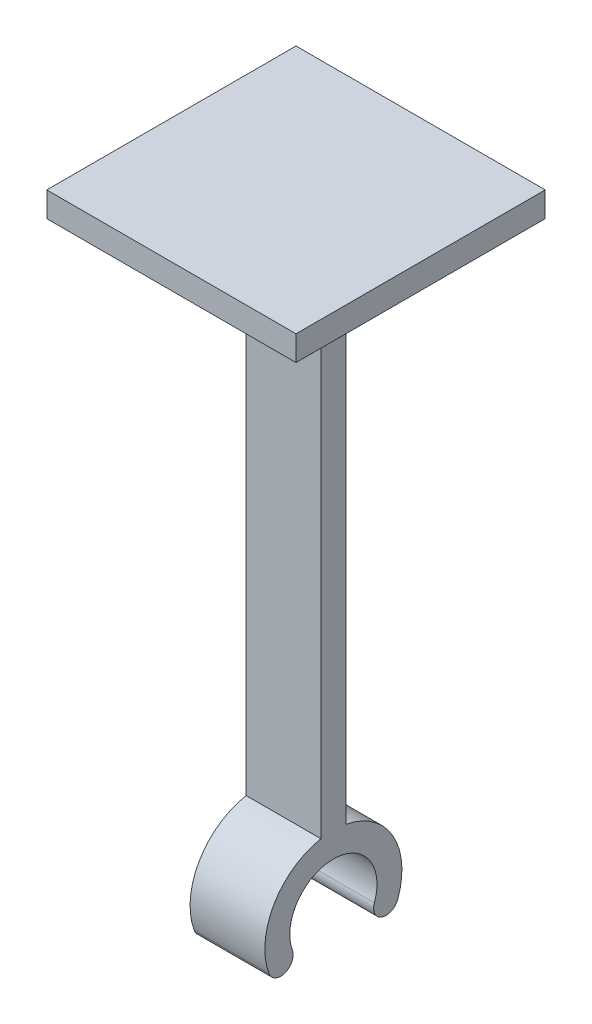
ISO-10303-21;
HEADER;
FILE_DESCRIPTION(('STEP AP214'),'2;1');
FILE_NAME('part.step','',(''),(''),'','','');
FILE_SCHEMA(('AUTOMOTIVE_DESIGN { 1 0 10303 214 1 1 1 1 }'));
ENDSEC;
DATA;
#1=APPLICATION_CONTEXT('core data for automotive mechanical design processes');
#2=APPLICATION_PROTOCOL_DEFINITION('international standard','automotive_design',2000,#1);
#3=PRODUCT_CONTEXT('',#1,'mechanical');
#4=PRODUCT('Part','Part','',(#3));
#5=PRODUCT_RELATED_PRODUCT_CATEGORY('part','',(#4));
#6=PRODUCT_DEFINITION_FORMATION('','',#4);
#7=PRODUCT_DEFINITION_CONTEXT('part definition',#1,'design');
#8=PRODUCT_DEFINITION('design','',#6,#7);
#9=PRODUCT_DEFINITION_SHAPE('','',#8);
#10=(LENGTH_UNIT() NAMED_UNIT(*) SI_UNIT(.MILLI.,.METRE.));
#11=(NAMED_UNIT(*) PLANE_ANGLE_UNIT() SI_UNIT($,.RADIAN.));
#12=(NAMED_UNIT(*) SI_UNIT($,.STERADIAN.) SOLID_ANGLE_UNIT());
#13=UNCERTAINTY_MEASURE_WITH_UNIT(LENGTH_MEASURE(1.E-05),#10,'distance_accuracy_value','');
#14=(GEOMETRIC_REPRESENTATION_CONTEXT(3) GLOBAL_UNCERTAINTY_ASSIGNED_CONTEXT((#13)) GLOBAL_UNIT_ASSIGNED_CONTEXT((#10,
#11,#12)) REPRESENTATION_CONTEXT('',''));
#15=CARTESIAN_POINT('',(0.,0.,0.));
#16=DIRECTION('',(0.,0.,1.));
#17=DIRECTION('',(1.,0.,0.));
#18=AXIS2_PLACEMENT_3D('',#15,#16,#17);
#19=CARTESIAN_POINT('',(3.,0.,0.));
#20=DIRECTION('',(-1.,0.,0.));
#21=DIRECTION('',(0.,0.,1.));
#22=AXIS2_PLACEMENT_3D('',#19,#20,#21);
#23=CYLINDRICAL_SURFACE('',#22,5.5);
#24=CARTESIAN_POINT('',(-3.,0.,0.));
#25=DIRECTION('',(1.,0.,0.));
#26=DIRECTION('',(0.,0.,-1.));
#27=AXIS2_PLACEMENT_3D('',#24,#25,#26);
#28=CIRCLE('',#27,5.5);
#29=CARTESIAN_POINT('',(-3.,-1.88111078829118,-5.16830941432249));
#30=VERTEX_POINT('',#29);
#31=CARTESIAN_POINT('',(-3.,5.40832691319598,-1.));
#32=VERTEX_POINT('',#31);
#33=EDGE_CURVE('E206',#30,#32,#28,.T.);
#34=ORIENTED_EDGE('',*,*,#33,.T.);
#35=DIRECTION('',(-1.,0.,0.));
#36=VECTOR('',#35,1.);
#37=CARTESIAN_POINT('',(3.,5.40832691319598,-1.));
#38=LINE('',#37,#36);
#39=CARTESIAN_POINT('',(3.,5.40832691319598,-1.));
#40=VERTEX_POINT('',#39);
#41=EDGE_CURVE('E65',#40,#32,#38,.T.);
#42=ORIENTED_EDGE('',*,*,#41,.F.);
#43=CARTESIAN_POINT('',(3.,0.,0.));
#44=DIRECTION('',(1.,0.,0.));
#45=DIRECTION('',(0.,0.,-1.));
#46=AXIS2_PLACEMENT_3D('',#43,#44,#45);
#47=CIRCLE('',#46,5.5);
#48=CARTESIAN_POINT('',(3.,-1.88111078829118,-5.16830941432249));
#49=VERTEX_POINT('',#48);
#50=EDGE_CURVE('E221',#49,#40,#47,.T.);
#51=ORIENTED_EDGE('',*,*,#50,.F.);
#52=DIRECTION('',(-1.,0.,0.));
#53=VECTOR('',#52,1.);
#54=CARTESIAN_POINT('',(3.,-1.88111078829118,-5.16830941432249));
#55=LINE('',#54,#53);
#56=EDGE_CURVE('E50',#49,#30,#55,.T.);
#57=ORIENTED_EDGE('',*,*,#56,.T.);
#58=EDGE_LOOP('',(#34,#42,#51,#57));
#59=FACE_BOUND('',#58,.T.);
#60=ADVANCED_FACE('F41',(#59),#23,.T.);
#61=DIRECTION('',(-1.,0.,0.));
#62=VECTOR('',#61,1.);
#63=CARTESIAN_POINT('',(3.,5.40832691319598,1.));
#64=LINE('',#63,#62);
#65=CARTESIAN_POINT('',(3.,5.40832691319598,1.));
#66=VERTEX_POINT('',#65);
#67=CARTESIAN_POINT('',(-3.,5.40832691319598,0.999999999999995));
#68=VERTEX_POINT('',#67);
#69=EDGE_CURVE('E57',#66,#68,#64,.T.);
#70=ORIENTED_EDGE('',*,*,#69,.T.);
#71=CARTESIAN_POINT('',(-3.,-1.88111078829118,5.16830941432249));
#72=VERTEX_POINT('',#71);
#73=EDGE_CURVE('E205',#68,#72,#28,.T.);
#74=ORIENTED_EDGE('',*,*,#73,.T.);
#75=DIRECTION('',(-1.,0.,0.));
#76=VECTOR('',#75,1.);
#77=CARTESIAN_POINT('',(3.,-1.88111078829118,5.16830941432249));
#78=LINE('',#77,#76);
#79=CARTESIAN_POINT('',(3.,-1.88111078829118,5.16830941432249));
#80=VERTEX_POINT('',#79);
#81=EDGE_CURVE('E233',#80,#72,#78,.T.);
#82=ORIENTED_EDGE('',*,*,#81,.F.);
#83=EDGE_CURVE('E220',#66,#80,#47,.T.);
#84=ORIENTED_EDGE('',*,*,#83,.F.);
#85=EDGE_LOOP('',(#70,#74,#82,#84));
#86=FACE_BOUND('',#85,.T.);
#87=ADVANCED_FACE('F266',(#86),#23,.T.);
#88=CARTESIAN_POINT('',(3.,0.,0.));
#89=DIRECTION('',(-1.,0.,0.));
#90=DIRECTION('',(0.,0.,1.));
#91=AXIS2_PLACEMENT_3D('',#88,#89,#90);
#92=CYLINDRICAL_SURFACE('',#91,3.5);
#93=DIRECTION('',(-1.,0.,0.));
#94=VECTOR('',#93,1.);
#95=CARTESIAN_POINT('',(3.,-1.19707050163984,3.28892417275068));
#96=LINE('',#95,#94);
#97=CARTESIAN_POINT('',(3.,-1.19707050163984,3.28892417275068));
#98=VERTEX_POINT('',#97);
#99=CARTESIAN_POINT('',(-3.,-1.19707050163984,3.28892417275068));
#100=VERTEX_POINT('',#99);
#101=EDGE_CURVE('E229',#98,#100,#96,.T.);
#102=ORIENTED_EDGE('',*,*,#101,.T.);
#103=CARTESIAN_POINT('',(-3.,0.,0.));
#104=DIRECTION('',(1.,0.,0.));
#105=DIRECTION('',(0.,0.,-1.));
#106=AXIS2_PLACEMENT_3D('',#103,#104,#105);
#107=CIRCLE('',#106,3.5);
#108=CARTESIAN_POINT('',(-3.,-1.19707050163984,-3.28892417275068));
#109=VERTEX_POINT('',#108);
#110=EDGE_CURVE('E198',#109,#100,#107,.T.);
#111=ORIENTED_EDGE('',*,*,#110,.F.);
#112=DIRECTION('',(-1.,0.,0.));
#113=VECTOR('',#112,1.);
#114=CARTESIAN_POINT('',(3.,-1.19707050163984,-3.28892417275068));
#115=LINE('',#114,#113);
#116=CARTESIAN_POINT('',(3.,-1.19707050163984,-3.28892417275068));
#117=VERTEX_POINT('',#116);
#118=EDGE_CURVE('E11',#117,#109,#115,.T.);
#119=ORIENTED_EDGE('',*,*,#118,.F.);
#120=CARTESIAN_POINT('',(3.,0.,0.));
#121=DIRECTION('',(1.,0.,0.));
#122=DIRECTION('',(0.,0.,-1.));
#123=AXIS2_PLACEMENT_3D('',#120,#121,#122);
#124=CIRCLE('',#123,3.5);
#125=EDGE_CURVE('E213',#117,#98,#124,.T.);
#126=ORIENTED_EDGE('',*,*,#125,.T.);
#127=EDGE_LOOP('',(#102,#111,#119,#126));
#128=FACE_BOUND('',#127,.T.);
#129=ADVANCED_FACE('F43',(#128),#92,.F.);
#130=CARTESIAN_POINT('',(3.,-1.53909064496551,-4.22861679353659));
#131=DIRECTION('',(-1.,0.,0.));
#132=DIRECTION('',(0.,0.,1.));
#133=AXIS2_PLACEMENT_3D('',#130,#131,#132);
#134=CYLINDRICAL_SURFACE('',#133,1.);
#135=ORIENTED_EDGE('',*,*,#118,.T.);
#136=CARTESIAN_POINT('',(-3.,-1.53909064496551,-4.22861679353659));
#137=DIRECTION('',(1.,0.,0.));
#138=DIRECTION('',(0.,0.,-1.));
#139=AXIS2_PLACEMENT_3D('',#136,#137,#138);
#140=CIRCLE('',#139,1.);
#141=EDGE_CURVE('E201',#30,#109,#140,.F.);
#142=ORIENTED_EDGE('',*,*,#141,.F.);
#143=ORIENTED_EDGE('',*,*,#56,.F.);
#144=CARTESIAN_POINT('',(3.,-1.53909064496551,-4.22861679353659));
#145=DIRECTION('',(1.,0.,0.));
#146=DIRECTION('',(0.,0.,-1.));
#147=AXIS2_PLACEMENT_3D('',#144,#145,#146);
#148=CIRCLE('',#147,1.);
#149=EDGE_CURVE('E216',#49,#117,#148,.F.);
#150=ORIENTED_EDGE('',*,*,#149,.T.);
#151=EDGE_LOOP('',(#135,#142,#143,#150));
#152=FACE_BOUND('',#151,.T.);
#153=ADVANCED_FACE('F243',(#152),#134,.T.);
#154=CARTESIAN_POINT('',(3.,-1.53909064496551,4.22861679353659));
#155=DIRECTION('',(-1.,0.,0.));
#156=DIRECTION('',(0.,0.,1.));
#157=AXIS2_PLACEMENT_3D('',#154,#155,#156);
#158=CYLINDRICAL_SURFACE('',#157,1.);
#159=ORIENTED_EDGE('',*,*,#81,.T.);
#160=CARTESIAN_POINT('',(-3.,-1.53909064496551,4.22861679353659));
#161=DIRECTION('',(1.,0.,0.));
#162=DIRECTION('',(0.,0.,-1.));
#163=AXIS2_PLACEMENT_3D('',#160,#161,#162);
#164=CIRCLE('',#163,1.);
#165=EDGE_CURVE('E209',#72,#100,#164,.T.);
#166=ORIENTED_EDGE('',*,*,#165,.T.);
#167=ORIENTED_EDGE('',*,*,#101,.F.);
#168=CARTESIAN_POINT('',(3.,-1.53909064496551,4.22861679353659));
#169=DIRECTION('',(1.,0.,0.));
#170=DIRECTION('',(0.,0.,-1.));
#171=AXIS2_PLACEMENT_3D('',#168,#169,#170);
#172=CIRCLE('',#171,1.);
#173=EDGE_CURVE('E225',#80,#98,#172,.T.);
#174=ORIENTED_EDGE('',*,*,#173,.F.);
#175=EDGE_LOOP('',(#159,#166,#167,#174));
#176=FACE_BOUND('',#175,.T.);
#177=ADVANCED_FACE('F264',(#176),#158,.T.);
#178=CARTESIAN_POINT('',(3.,0.,0.));
#179=DIRECTION('',(1.,0.,0.));
#180=DIRECTION('',(0.,0.,-1.));
#181=AXIS2_PLACEMENT_3D('',#178,#179,#180);
#182=PLANE('',#181);
#183=ORIENTED_EDGE('',*,*,#173,.T.);
#184=ORIENTED_EDGE('',*,*,#125,.F.);
#185=ORIENTED_EDGE('',*,*,#149,.F.);
#186=ORIENTED_EDGE('',*,*,#50,.T.);
#187=DIRECTION('',(0.,1.,0.));
#188=VECTOR('',#187,1.);
#189=CARTESIAN_POINT('',(3.,0.,-1.));
#190=LINE('',#189,#188);
#191=CARTESIAN_POINT('',(3.,46.5,-1.));
#192=VERTEX_POINT('',#191);
#193=EDGE_CURVE('E176',#40,#192,#190,.T.);
#194=ORIENTED_EDGE('',*,*,#193,.T.);
#195=DIRECTION('',(0.,0.,-1.));
#196=VECTOR('',#195,1.);
#197=CARTESIAN_POINT('',(3.,46.5,0.));
#198=LINE('',#197,#196);
#199=CARTESIAN_POINT('',(3.,46.5,1.));
#200=VERTEX_POINT('',#199);
#201=EDGE_CURVE('E180',#200,#192,#198,.T.);
#202=ORIENTED_EDGE('',*,*,#201,.F.);
#203=DIRECTION('',(0.,1.,0.));
#204=VECTOR('',#203,1.);
#205=CARTESIAN_POINT('',(3.,0.,1.));
#206=LINE('',#205,#204);
#207=EDGE_CURVE('E184',#66,#200,#206,.T.);
#208=ORIENTED_EDGE('',*,*,#207,.F.);
#209=ORIENTED_EDGE('',*,*,#83,.T.);
#210=EDGE_LOOP('',(#183,#184,#185,#186,#194,#202,#208,#209));
#211=FACE_BOUND('',#210,.T.);
#212=ADVANCED_FACE('F257',(#211),#182,.T.);
#213=CARTESIAN_POINT('',(-3.,0.,0.));
#214=DIRECTION('',(1.,0.,0.));
#215=DIRECTION('',(0.,0.,-1.));
#216=AXIS2_PLACEMENT_3D('',#213,#214,#215);
#217=PLANE('',#216);
#218=ORIENTED_EDGE('',*,*,#110,.T.);
#219=ORIENTED_EDGE('',*,*,#165,.F.);
#220=ORIENTED_EDGE('',*,*,#73,.F.);
#221=DIRECTION('',(0.,-1.,0.));
#222=VECTOR('',#221,1.);
#223=CARTESIAN_POINT('',(-3.,0.,0.999999999999995));
#224=LINE('',#223,#222);
#225=CARTESIAN_POINT('',(-3.,46.5,1.));
#226=VERTEX_POINT('',#225);
#227=EDGE_CURVE('E172',#226,#68,#224,.T.);
#228=ORIENTED_EDGE('',*,*,#227,.F.);
#229=DIRECTION('',(0.,0.,-1.));
#230=VECTOR('',#229,1.);
#231=CARTESIAN_POINT('',(-3.,46.5,0.));
#232=LINE('',#231,#230);
#233=CARTESIAN_POINT('',(-3.,46.5,-1.));
#234=VERTEX_POINT('',#233);
#235=EDGE_CURVE('E164',#226,#234,#232,.T.);
#236=ORIENTED_EDGE('',*,*,#235,.T.);
#237=DIRECTION('',(0.,-1.,0.));
#238=VECTOR('',#237,1.);
#239=CARTESIAN_POINT('',(-3.,0.,-1.00000000000001));
#240=LINE('',#239,#238);
#241=EDGE_CURVE('E159',#234,#32,#240,.T.);
#242=ORIENTED_EDGE('',*,*,#241,.T.);
#243=ORIENTED_EDGE('',*,*,#33,.F.);
#244=ORIENTED_EDGE('',*,*,#141,.T.);
#245=EDGE_LOOP('',(#218,#219,#220,#228,#236,#242,#243,#244));
#246=FACE_BOUND('',#245,.T.);
#247=ADVANCED_FACE('F246',(#246),#217,.F.);
#248=CARTESIAN_POINT('',(3.,0.,-1.));
#249=DIRECTION('',(0.,0.,1.));
#250=DIRECTION('',(1.,0.,0.));
#251=AXIS2_PLACEMENT_3D('',#248,#249,#250);
#252=PLANE('',#251);
#253=ORIENTED_EDGE('',*,*,#193,.F.);
#254=ORIENTED_EDGE('',*,*,#41,.T.);
#255=ORIENTED_EDGE('',*,*,#241,.F.);
#256=DIRECTION('',(-1.,0.,0.));
#257=VECTOR('',#256,1.);
#258=CARTESIAN_POINT('',(3.,46.5,-1.));
#259=LINE('',#258,#257);
#260=EDGE_CURVE('E190',#192,#234,#259,.T.);
#261=ORIENTED_EDGE('',*,*,#260,.F.);
#262=EDGE_LOOP('',(#253,#254,#255,#261));
#263=FACE_BOUND('',#262,.T.);
#264=ADVANCED_FACE('F249',(#263),#252,.F.);
#265=CARTESIAN_POINT('',(3.,0.,1.));
#266=DIRECTION('',(0.,0.,1.));
#267=DIRECTION('',(1.,0.,0.));
#268=AXIS2_PLACEMENT_3D('',#265,#266,#267);
#269=PLANE('',#268);
#270=ORIENTED_EDGE('',*,*,#69,.F.);
#271=ORIENTED_EDGE('',*,*,#207,.T.);
#272=DIRECTION('',(-1.,0.,0.));
#273=VECTOR('',#272,1.);
#274=CARTESIAN_POINT('',(3.,46.5,1.));
#275=LINE('',#274,#273);
#276=EDGE_CURVE('E187',#200,#226,#275,.T.);
#277=ORIENTED_EDGE('',*,*,#276,.T.);
#278=ORIENTED_EDGE('',*,*,#227,.T.);
#279=EDGE_LOOP('',(#270,#271,#277,#278));
#280=FACE_BOUND('',#279,.T.);
#281=ADVANCED_FACE('F270',(#280),#269,.T.);
#282=CARTESIAN_POINT('',(10.,48.5,10.));
#283=DIRECTION('',(-1.,0.,0.));
#284=DIRECTION('',(0.,0.,1.));
#285=AXIS2_PLACEMENT_3D('',#282,#283,#284);
#286=PLANE('',#285);
#287=DIRECTION('',(0.,0.,-1.));
#288=VECTOR('',#287,1.);
#289=CARTESIAN_POINT('',(10.,46.5,10.));
#290=LINE('',#289,#288);
#291=CARTESIAN_POINT('',(10.,46.5,10.));
#292=VERTEX_POINT('',#291);
#293=CARTESIAN_POINT('',(10.,46.5,-10.));
#294=VERTEX_POINT('',#293);
#295=EDGE_CURVE('E157',#292,#294,#290,.T.);
#296=ORIENTED_EDGE('',*,*,#295,.T.);
#297=DIRECTION('',(0.,-1.,0.));
#298=VECTOR('',#297,1.);
#299=CARTESIAN_POINT('',(10.,48.5,-10.));
#300=LINE('',#299,#298);
#301=CARTESIAN_POINT('',(10.,48.5,-10.));
#302=VERTEX_POINT('',#301);
#303=EDGE_CURVE('E135',#302,#294,#300,.T.);
#304=ORIENTED_EDGE('',*,*,#303,.F.);
#305=DIRECTION('',(0.,0.,-1.));
#306=VECTOR('',#305,1.);
#307=CARTESIAN_POINT('',(10.,48.5,10.));
#308=LINE('',#307,#306);
#309=CARTESIAN_POINT('',(10.,48.5,10.));
#310=VERTEX_POINT('',#309);
#311=EDGE_CURVE('E143',#310,#302,#308,.T.);
#312=ORIENTED_EDGE('',*,*,#311,.F.);
#313=DIRECTION('',(0.,-1.,0.));
#314=VECTOR('',#313,1.);
#315=CARTESIAN_POINT('',(10.,48.5,10.));
#316=LINE('',#315,#314);
#317=EDGE_CURVE('E394',#310,#292,#316,.T.);
#318=ORIENTED_EDGE('',*,*,#317,.T.);
#319=EDGE_LOOP('',(#296,#304,#312,#318));
#320=FACE_BOUND('',#319,.T.);
#321=ADVANCED_FACE('F155',(#320),#286,.F.);
#322=CARTESIAN_POINT('',(-10.,48.5,-10.));
#323=DIRECTION('',(0.,0.,1.));
#324=DIRECTION('',(1.,0.,0.));
#325=AXIS2_PLACEMENT_3D('',#322,#323,#324);
#326=PLANE('',#325);
#327=DIRECTION('',(-1.,0.,0.));
#328=VECTOR('',#327,1.);
#329=CARTESIAN_POINT('',(-10.,46.5,-10.));
#330=LINE('',#329,#328);
#331=CARTESIAN_POINT('',(-10.,46.5,-10.));
#332=VERTEX_POINT('',#331);
#333=EDGE_CURVE('E402',#294,#332,#330,.T.);
#334=ORIENTED_EDGE('',*,*,#333,.T.);
#335=DIRECTION('',(0.,-1.,0.));
#336=VECTOR('',#335,1.);
#337=CARTESIAN_POINT('',(-10.,48.5,-10.));
#338=LINE('',#337,#336);
#339=CARTESIAN_POINT('',(-10.,48.5,-10.));
#340=VERTEX_POINT('',#339);
#341=EDGE_CURVE('E138',#340,#332,#338,.T.);
#342=ORIENTED_EDGE('',*,*,#341,.F.);
#343=DIRECTION('',(-1.,0.,0.));
#344=VECTOR('',#343,1.);
#345=CARTESIAN_POINT('',(-10.,48.5,-10.));
#346=LINE('',#345,#344);
#347=EDGE_CURVE('E131',#302,#340,#346,.T.);
#348=ORIENTED_EDGE('',*,*,#347,.F.);
#349=ORIENTED_EDGE('',*,*,#303,.T.);
#350=EDGE_LOOP('',(#334,#342,#348,#349));
#351=FACE_BOUND('',#350,.T.);
#352=ADVANCED_FACE('F133',(#351),#326,.F.);
#353=CARTESIAN_POINT('',(-10.,48.5,10.));
#354=DIRECTION('',(1.,0.,0.));
#355=DIRECTION('',(0.,0.,-1.));
#356=AXIS2_PLACEMENT_3D('',#353,#354,#355);
#357=PLANE('',#356);
#358=DIRECTION('',(0.,0.,1.));
#359=VECTOR('',#358,1.);
#360=CARTESIAN_POINT('',(-10.,46.5,10.));
#361=LINE('',#360,#359);
#362=CARTESIAN_POINT('',(-10.,46.5,10.));
#363=VERTEX_POINT('',#362);
#364=EDGE_CURVE('E398',#332,#363,#361,.T.);
#365=ORIENTED_EDGE('',*,*,#364,.T.);
#366=DIRECTION('',(0.,-1.,0.));
#367=VECTOR('',#366,1.);
#368=CARTESIAN_POINT('',(-10.,48.5,10.));
#369=LINE('',#368,#367);
#370=CARTESIAN_POINT('',(-10.,48.5,10.));
#371=VERTEX_POINT('',#370);
#372=EDGE_CURVE('E166',#371,#363,#369,.T.);
#373=ORIENTED_EDGE('',*,*,#372,.F.);
#374=DIRECTION('',(0.,0.,1.));
#375=VECTOR('',#374,1.);
#376=CARTESIAN_POINT('',(-10.,48.5,10.));
#377=LINE('',#376,#375);
#378=EDGE_CURVE('E142',#340,#371,#377,.T.);
#379=ORIENTED_EDGE('',*,*,#378,.F.);
#380=ORIENTED_EDGE('',*,*,#341,.T.);
#381=EDGE_LOOP('',(#365,#373,#379,#380));
#382=FACE_BOUND('',#381,.T.);
#383=ADVANCED_FACE('F353',(#382),#357,.F.);
#384=CARTESIAN_POINT('',(-10.,48.5,10.));
#385=DIRECTION('',(0.,0.,-1.));
#386=DIRECTION('',(-1.,0.,0.));
#387=AXIS2_PLACEMENT_3D('',#384,#385,#386);
#388=PLANE('',#387);
#389=DIRECTION('',(1.,0.,0.));
#390=VECTOR('',#389,1.);
#391=CARTESIAN_POINT('',(-10.,46.5,10.));
#392=LINE('',#391,#390);
#393=EDGE_CURVE('E153',#363,#292,#392,.T.);
#394=ORIENTED_EDGE('',*,*,#393,.T.);
#395=ORIENTED_EDGE('',*,*,#317,.F.);
#396=DIRECTION('',(1.,0.,0.));
#397=VECTOR('',#396,1.);
#398=CARTESIAN_POINT('',(-10.,48.5,10.));
#399=LINE('',#398,#397);
#400=EDGE_CURVE('E148',#371,#310,#399,.T.);
#401=ORIENTED_EDGE('',*,*,#400,.F.);
#402=ORIENTED_EDGE('',*,*,#372,.T.);
#403=EDGE_LOOP('',(#394,#395,#401,#402));
#404=FACE_BOUND('',#403,.T.);
#405=ADVANCED_FACE('F362',(#404),#388,.F.);
#406=CARTESIAN_POINT('',(0.,48.5,0.));
#407=DIRECTION('',(0.,-1.,0.));
#408=DIRECTION('',(0.,0.,-1.));
#409=AXIS2_PLACEMENT_3D('',#406,#407,#408);
#410=PLANE('',#409);
#411=ORIENTED_EDGE('',*,*,#311,.T.);
#412=ORIENTED_EDGE('',*,*,#347,.T.);
#413=ORIENTED_EDGE('',*,*,#378,.T.);
#414=ORIENTED_EDGE('',*,*,#400,.T.);
#415=EDGE_LOOP('',(#411,#412,#413,#414));
#416=FACE_BOUND('',#415,.T.);
#417=ADVANCED_FACE('F146',(#416),#410,.F.);
#418=CARTESIAN_POINT('',(0.,46.5,0.));
#419=DIRECTION('',(0.,-1.,0.));
#420=DIRECTION('',(0.,0.,-1.));
#421=AXIS2_PLACEMENT_3D('',#418,#419,#420);
#422=PLANE('',#421);
#423=ORIENTED_EDGE('',*,*,#201,.T.);
#424=ORIENTED_EDGE('',*,*,#260,.T.);
#425=ORIENTED_EDGE('',*,*,#235,.F.);
#426=ORIENTED_EDGE('',*,*,#276,.F.);
#427=EDGE_LOOP('',(#423,#424,#425,#426));
#428=FACE_BOUND('',#427,.T.);
#429=ORIENTED_EDGE('',*,*,#295,.F.);
#430=ORIENTED_EDGE('',*,*,#393,.F.);
#431=ORIENTED_EDGE('',*,*,#364,.F.);
#432=ORIENTED_EDGE('',*,*,#333,.F.);
#433=EDGE_LOOP('',(#429,#430,#431,#432));
#434=FACE_BOUND('',#433,.T.);
#435=ADVANCED_FACE('F251',(#428,#434),#422,.T.);
#436=CLOSED_SHELL('',(#60,#87,#129,#153,#177,#212,#247,#264,#281,#321,#352,#383,#405,#417,#435));
#437=MANIFOLD_SOLID_BREP('B2',#436);
#438=ADVANCED_BREP_SHAPE_REPRESENTATION('',(#18,#437),#14);
#439=SHAPE_DEFINITION_REPRESENTATION(#9,#438);
ENDSEC;
END-ISO-10303-21;
